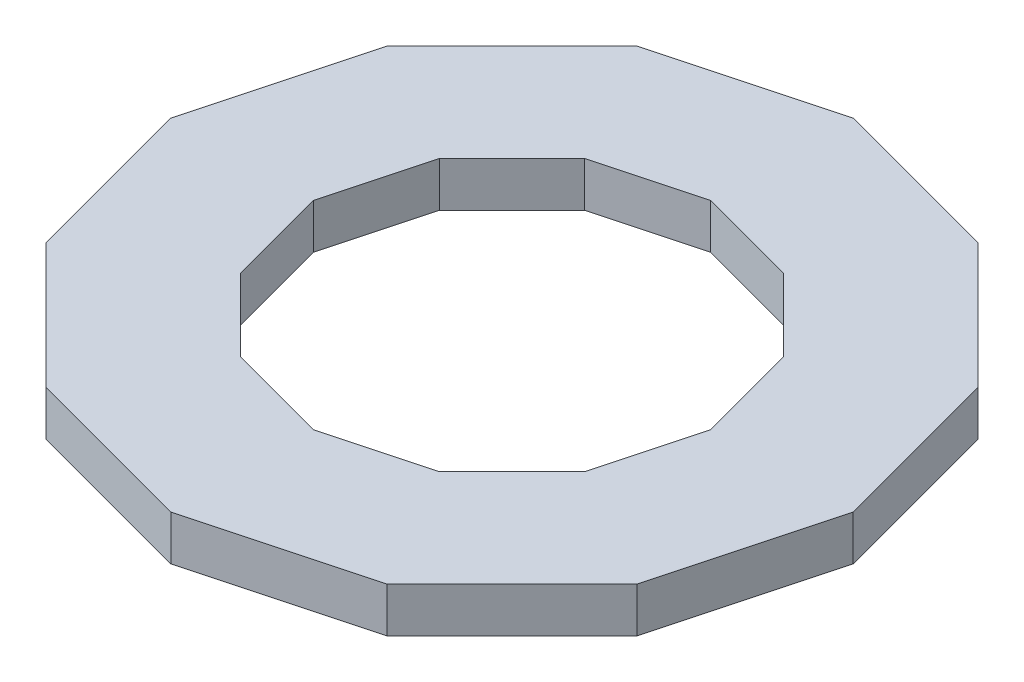
ISO-10303-21;
HEADER;
FILE_DESCRIPTION(('STEP AP214'),'2;1');
FILE_NAME('part.step','',(''),(''),'','','');
FILE_SCHEMA(('AUTOMOTIVE_DESIGN { 1 0 10303 214 1 1 1 1 }'));
ENDSEC;
DATA;
#1=APPLICATION_CONTEXT('core data for automotive mechanical design processes');
#2=APPLICATION_PROTOCOL_DEFINITION('international standard','automotive_design',2000,#1);
#3=PRODUCT_CONTEXT('',#1,'mechanical');
#4=PRODUCT('Part','Part','',(#3));
#5=PRODUCT_RELATED_PRODUCT_CATEGORY('part','',(#4));
#6=PRODUCT_DEFINITION_FORMATION('','',#4);
#7=PRODUCT_DEFINITION_CONTEXT('part definition',#1,'design');
#8=PRODUCT_DEFINITION('design','',#6,#7);
#9=PRODUCT_DEFINITION_SHAPE('','',#8);
#10=(LENGTH_UNIT() NAMED_UNIT(*) SI_UNIT(.MILLI.,.METRE.));
#11=(NAMED_UNIT(*) PLANE_ANGLE_UNIT() SI_UNIT($,.RADIAN.));
#12=(NAMED_UNIT(*) SI_UNIT($,.STERADIAN.) SOLID_ANGLE_UNIT());
#13=UNCERTAINTY_MEASURE_WITH_UNIT(LENGTH_MEASURE(1.E-05),#10,'distance_accuracy_value','');
#14=(GEOMETRIC_REPRESENTATION_CONTEXT(3) GLOBAL_UNCERTAINTY_ASSIGNED_CONTEXT((#13)) GLOBAL_UNIT_ASSIGNED_CONTEXT((#10,
#11,#12)) REPRESENTATION_CONTEXT('',''));
#15=CARTESIAN_POINT('',(0.,0.,0.));
#16=DIRECTION('',(0.,0.,1.));
#17=DIRECTION('',(1.,0.,0.));
#18=AXIS2_PLACEMENT_3D('',#15,#16,#17);
#19=CARTESIAN_POINT('',(0.,19.05,0.));
#20=DIRECTION('',(0.,1.,0.));
#21=DIRECTION('',(0.,0.,1.));
#22=AXIS2_PLACEMENT_3D('',#19,#20,#21);
#23=PLANE('',#22);
#24=DIRECTION('',(-0.258819045102521,0.,0.965925826289068));
#25=VECTOR('',#24,1.);
#26=CARTESIAN_POINT('',(-125.360333278148,19.05,-72.3768221638399));
#27=LINE('',#26,#25);
#28=CARTESIAN_POINT('',(-125.360333278148,19.05,-72.3768221638399));
#29=VERTEX_POINT('',#28);
#30=CARTESIAN_POINT('',(-144.75364432768,19.05,0.));
#31=VERTEX_POINT('',#30);
#32=EDGE_CURVE('E301',#29,#31,#27,.T.);
#33=ORIENTED_EDGE('',*,*,#32,.T.);
#34=DIRECTION('',(0.258819045102521,0.,0.965925826289068));
#35=VECTOR('',#34,1.);
#36=CARTESIAN_POINT('',(-144.75364432768,19.05,0.));
#37=LINE('',#36,#35);
#38=CARTESIAN_POINT('',(-125.360333278148,19.05,72.3768221638398));
#39=VERTEX_POINT('',#38);
#40=EDGE_CURVE('E304',#31,#39,#37,.T.);
#41=ORIENTED_EDGE('',*,*,#40,.T.);
#42=DIRECTION('',(0.707106781186547,0.,0.707106781186548));
#43=VECTOR('',#42,1.);
#44=CARTESIAN_POINT('',(-125.360333278148,19.05,72.3768221638398));
#45=LINE('',#44,#43);
#46=CARTESIAN_POINT('',(-72.3768221638398,19.05,125.360333278148));
#47=VERTEX_POINT('',#46);
#48=EDGE_CURVE('E307',#39,#47,#45,.T.);
#49=ORIENTED_EDGE('',*,*,#48,.T.);
#50=DIRECTION('',(0.965925826289068,0.,0.25881904510252));
#51=VECTOR('',#50,1.);
#52=CARTESIAN_POINT('',(-72.3768221638398,19.05,125.360333278148));
#53=LINE('',#52,#51);
#54=CARTESIAN_POINT('',(0.,19.05,144.75364432768));
#55=VERTEX_POINT('',#54);
#56=EDGE_CURVE('E309',#47,#55,#53,.T.);
#57=ORIENTED_EDGE('',*,*,#56,.T.);
#58=DIRECTION('',(0.965925826289068,0.,-0.258819045102521));
#59=VECTOR('',#58,1.);
#60=CARTESIAN_POINT('',(0.,19.05,144.75364432768));
#61=LINE('',#60,#59);
#62=CARTESIAN_POINT('',(72.3768221638398,19.05,125.360333278148));
#63=VERTEX_POINT('',#62);
#64=EDGE_CURVE('E311',#55,#63,#61,.T.);
#65=ORIENTED_EDGE('',*,*,#64,.T.);
#66=DIRECTION('',(0.707106781186548,0.,-0.707106781186547));
#67=VECTOR('',#66,1.);
#68=CARTESIAN_POINT('',(72.3768221638398,19.05,125.360333278148));
#69=LINE('',#68,#67);
#70=CARTESIAN_POINT('',(125.360333278148,19.05,72.3768221638399));
#71=VERTEX_POINT('',#70);
#72=EDGE_CURVE('E313',#63,#71,#69,.T.);
#73=ORIENTED_EDGE('',*,*,#72,.T.);
#74=DIRECTION('',(0.258819045102521,0.,-0.965925826289068));
#75=VECTOR('',#74,1.);
#76=CARTESIAN_POINT('',(125.360333278148,19.05,72.3768221638399));
#77=LINE('',#76,#75);
#78=CARTESIAN_POINT('',(144.75364432768,19.05,0.));
#79=VERTEX_POINT('',#78);
#80=EDGE_CURVE('E315',#71,#79,#77,.T.);
#81=ORIENTED_EDGE('',*,*,#80,.T.);
#82=DIRECTION('',(-0.258819045102521,0.,-0.965925826289068));
#83=VECTOR('',#82,1.);
#84=CARTESIAN_POINT('',(144.75364432768,19.05,0.));
#85=LINE('',#84,#83);
#86=CARTESIAN_POINT('',(125.360333278148,19.05,-72.3768221638398));
#87=VERTEX_POINT('',#86);
#88=EDGE_CURVE('E317',#79,#87,#85,.T.);
#89=ORIENTED_EDGE('',*,*,#88,.T.);
#90=DIRECTION('',(-0.707106781186547,0.,-0.707106781186548));
#91=VECTOR('',#90,1.);
#92=CARTESIAN_POINT('',(125.360333278148,19.05,-72.3768221638398));
#93=LINE('',#92,#91);
#94=CARTESIAN_POINT('',(72.3768221638398,19.05,-125.360333278148));
#95=VERTEX_POINT('',#94);
#96=EDGE_CURVE('E319',#87,#95,#93,.T.);
#97=ORIENTED_EDGE('',*,*,#96,.T.);
#98=DIRECTION('',(-0.965925826289068,0.,-0.25881904510252));
#99=VECTOR('',#98,1.);
#100=CARTESIAN_POINT('',(72.3768221638398,19.05,-125.360333278148));
#101=LINE('',#100,#99);
#102=CARTESIAN_POINT('',(0.,19.05,-144.75364432768));
#103=VERTEX_POINT('',#102);
#104=EDGE_CURVE('E321',#95,#103,#101,.T.);
#105=ORIENTED_EDGE('',*,*,#104,.T.);
#106=DIRECTION('',(-0.965925826289068,0.,0.258819045102521));
#107=VECTOR('',#106,1.);
#108=CARTESIAN_POINT('',(0.,19.05,-144.75364432768));
#109=LINE('',#108,#107);
#110=CARTESIAN_POINT('',(-72.3768221638398,19.05,-125.360333278148));
#111=VERTEX_POINT('',#110);
#112=EDGE_CURVE('E323',#103,#111,#109,.T.);
#113=ORIENTED_EDGE('',*,*,#112,.T.);
#114=DIRECTION('',(-0.707106781186548,0.,0.707106781186547));
#115=VECTOR('',#114,1.);
#116=CARTESIAN_POINT('',(-72.3768221638398,19.05,-125.360333278148));
#117=LINE('',#116,#115);
#118=EDGE_CURVE('E325',#111,#29,#117,.T.);
#119=ORIENTED_EDGE('',*,*,#118,.T.);
#120=EDGE_LOOP('',(#33,#41,#49,#57,#65,#73,#81,#89,#97,#105,#113,#119));
#121=FACE_BOUND('',#120,.T.);
#122=DIRECTION('',(0.258819045102521,0.,0.965925826289068));
#123=VECTOR('',#122,1.);
#124=CARTESIAN_POINT('',(-84.2728098681227,19.05,0.));
#125=LINE('',#124,#123);
#126=CARTESIAN_POINT('',(-84.2728098681227,19.05,0.));
#127=VERTEX_POINT('',#126);
#128=CARTESIAN_POINT('',(-72.9823941940902,19.05,42.1364049340614));
#129=VERTEX_POINT('',#128);
#130=EDGE_CURVE('E203',#127,#129,#125,.T.);
#131=ORIENTED_EDGE('',*,*,#130,.F.);
#132=DIRECTION('',(-0.25881904510252,0.,0.965925826289068));
#133=VECTOR('',#132,1.);
#134=CARTESIAN_POINT('',(-72.9823941940902,19.05,-42.1364049340613));
#135=LINE('',#134,#133);
#136=CARTESIAN_POINT('',(-72.9823941940902,19.05,-42.1364049340613));
#137=VERTEX_POINT('',#136);
#138=EDGE_CURVE('E195',#137,#127,#135,.T.);
#139=ORIENTED_EDGE('',*,*,#138,.F.);
#140=DIRECTION('',(-0.707106781186547,0.,0.707106781186548));
#141=VECTOR('',#140,1.);
#142=CARTESIAN_POINT('',(-42.1364049340614,19.05,-72.9823941940902));
#143=LINE('',#142,#141);
#144=CARTESIAN_POINT('',(-42.1364049340614,19.05,-72.9823941940902));
#145=VERTEX_POINT('',#144);
#146=EDGE_CURVE('E237',#145,#137,#143,.T.);
#147=ORIENTED_EDGE('',*,*,#146,.F.);
#148=DIRECTION('',(-0.965925826289068,0.,0.258819045102521));
#149=VECTOR('',#148,1.);
#150=CARTESIAN_POINT('',(0.,19.05,-84.2728098681227));
#151=LINE('',#150,#149);
#152=CARTESIAN_POINT('',(0.,19.05,-84.2728098681227));
#153=VERTEX_POINT('',#152);
#154=EDGE_CURVE('E235',#153,#145,#151,.T.);
#155=ORIENTED_EDGE('',*,*,#154,.F.);
#156=DIRECTION('',(-0.965925826289069,0.,-0.25881904510252));
#157=VECTOR('',#156,1.);
#158=CARTESIAN_POINT('',(42.1364049340613,19.05,-72.9823941940902));
#159=LINE('',#158,#157);
#160=CARTESIAN_POINT('',(42.1364049340613,19.05,-72.9823941940902));
#161=VERTEX_POINT('',#160);
#162=EDGE_CURVE('E233',#161,#153,#159,.T.);
#163=ORIENTED_EDGE('',*,*,#162,.F.);
#164=DIRECTION('',(-0.707106781186548,0.,-0.707106781186547));
#165=VECTOR('',#164,1.);
#166=CARTESIAN_POINT('',(72.9823941940902,19.05,-42.1364049340614));
#167=LINE('',#166,#165);
#168=CARTESIAN_POINT('',(72.9823941940902,19.05,-42.1364049340614));
#169=VERTEX_POINT('',#168);
#170=EDGE_CURVE('E231',#169,#161,#167,.T.);
#171=ORIENTED_EDGE('',*,*,#170,.F.);
#172=DIRECTION('',(-0.258819045102521,0.,-0.965925826289068));
#173=VECTOR('',#172,1.);
#174=CARTESIAN_POINT('',(84.2728098681227,19.05,0.));
#175=LINE('',#174,#173);
#176=CARTESIAN_POINT('',(84.2728098681227,19.05,0.));
#177=VERTEX_POINT('',#176);
#178=EDGE_CURVE('E229',#177,#169,#175,.T.);
#179=ORIENTED_EDGE('',*,*,#178,.F.);
#180=DIRECTION('',(0.25881904510252,0.,-0.965925826289069));
#181=VECTOR('',#180,1.);
#182=CARTESIAN_POINT('',(72.9823941940902,19.05,42.1364049340613));
#183=LINE('',#182,#181);
#184=CARTESIAN_POINT('',(72.9823941940902,19.05,42.1364049340613));
#185=VERTEX_POINT('',#184);
#186=EDGE_CURVE('E226',#185,#177,#183,.T.);
#187=ORIENTED_EDGE('',*,*,#186,.F.);
#188=DIRECTION('',(0.707106781186547,0.,-0.707106781186548));
#189=VECTOR('',#188,1.);
#190=CARTESIAN_POINT('',(42.1364049340614,19.05,72.9823941940902));
#191=LINE('',#190,#189);
#192=CARTESIAN_POINT('',(42.1364049340614,19.05,72.9823941940902));
#193=VERTEX_POINT('',#192);
#194=EDGE_CURVE('E224',#193,#185,#191,.T.);
#195=ORIENTED_EDGE('',*,*,#194,.F.);
#196=DIRECTION('',(0.965925826289068,0.,-0.258819045102521));
#197=VECTOR('',#196,1.);
#198=CARTESIAN_POINT('',(0.,19.05,84.2728098681227));
#199=LINE('',#198,#197);
#200=CARTESIAN_POINT('',(0.,19.05,84.2728098681227));
#201=VERTEX_POINT('',#200);
#202=EDGE_CURVE('E222',#201,#193,#199,.T.);
#203=ORIENTED_EDGE('',*,*,#202,.F.);
#204=DIRECTION('',(0.965925826289068,0.,0.258819045102521));
#205=VECTOR('',#204,1.);
#206=CARTESIAN_POINT('',(-42.1364049340614,19.05,72.9823941940902));
#207=LINE('',#206,#205);
#208=CARTESIAN_POINT('',(-42.1364049340614,19.05,72.9823941940902));
#209=VERTEX_POINT('',#208);
#210=EDGE_CURVE('E218',#209,#201,#207,.T.);
#211=ORIENTED_EDGE('',*,*,#210,.F.);
#212=DIRECTION('',(0.707106781186548,0.,0.707106781186547));
#213=VECTOR('',#212,1.);
#214=CARTESIAN_POINT('',(-72.9823941940902,19.05,42.1364049340614));
#215=LINE('',#214,#213);
#216=EDGE_CURVE('E216',#129,#209,#215,.T.);
#217=ORIENTED_EDGE('',*,*,#216,.F.);
#218=EDGE_LOOP('',(#131,#139,#147,#155,#163,#171,#179,#187,#195,#203,#211,#217));
#219=FACE_BOUND('',#218,.T.);
#220=ADVANCED_FACE('F34',(#121,#219),#23,.T.);
#221=CARTESIAN_POINT('',(0.,0.,0.));
#222=DIRECTION('',(0.,1.,0.));
#223=DIRECTION('',(0.,0.,1.));
#224=AXIS2_PLACEMENT_3D('',#221,#222,#223);
#225=PLANE('',#224);
#226=DIRECTION('',(-0.258819045102521,0.,0.965925826289068));
#227=VECTOR('',#226,1.);
#228=CARTESIAN_POINT('',(-125.360333278148,0.,-72.3768221638399));
#229=LINE('',#228,#227);
#230=CARTESIAN_POINT('',(-125.360333278148,0.,-72.3768221638399));
#231=VERTEX_POINT('',#230);
#232=CARTESIAN_POINT('',(-144.75364432768,0.,0.));
#233=VERTEX_POINT('',#232);
#234=EDGE_CURVE('E211',#231,#233,#229,.T.);
#235=ORIENTED_EDGE('',*,*,#234,.F.);
#236=DIRECTION('',(-0.707106781186548,0.,0.707106781186547));
#237=VECTOR('',#236,1.);
#238=CARTESIAN_POINT('',(-72.3768221638398,0.,-125.360333278148));
#239=LINE('',#238,#237);
#240=CARTESIAN_POINT('',(-72.3768221638398,0.,-125.360333278148));
#241=VERTEX_POINT('',#240);
#242=EDGE_CURVE('E305',#241,#231,#239,.T.);
#243=ORIENTED_EDGE('',*,*,#242,.F.);
#244=DIRECTION('',(-0.965925826289068,0.,0.258819045102521));
#245=VECTOR('',#244,1.);
#246=CARTESIAN_POINT('',(0.,0.,-144.75364432768));
#247=LINE('',#246,#245);
#248=CARTESIAN_POINT('',(0.,0.,-144.75364432768));
#249=VERTEX_POINT('',#248);
#250=EDGE_CURVE('E348',#249,#241,#247,.T.);
#251=ORIENTED_EDGE('',*,*,#250,.F.);
#252=DIRECTION('',(-0.965925826289068,0.,-0.25881904510252));
#253=VECTOR('',#252,1.);
#254=CARTESIAN_POINT('',(72.3768221638398,0.,-125.360333278148));
#255=LINE('',#254,#253);
#256=CARTESIAN_POINT('',(72.3768221638398,0.,-125.360333278148));
#257=VERTEX_POINT('',#256);
#258=EDGE_CURVE('E346',#257,#249,#255,.T.);
#259=ORIENTED_EDGE('',*,*,#258,.F.);
#260=DIRECTION('',(-0.707106781186547,0.,-0.707106781186548));
#261=VECTOR('',#260,1.);
#262=CARTESIAN_POINT('',(125.360333278148,0.,-72.3768221638398));
#263=LINE('',#262,#261);
#264=CARTESIAN_POINT('',(125.360333278148,0.,-72.3768221638398));
#265=VERTEX_POINT('',#264);
#266=EDGE_CURVE('E344',#265,#257,#263,.T.);
#267=ORIENTED_EDGE('',*,*,#266,.F.);
#268=DIRECTION('',(-0.258819045102521,0.,-0.965925826289068));
#269=VECTOR('',#268,1.);
#270=CARTESIAN_POINT('',(144.75364432768,0.,0.));
#271=LINE('',#270,#269);
#272=CARTESIAN_POINT('',(144.75364432768,0.,0.));
#273=VERTEX_POINT('',#272);
#274=EDGE_CURVE('E342',#273,#265,#271,.T.);
#275=ORIENTED_EDGE('',*,*,#274,.F.);
#276=DIRECTION('',(0.258819045102521,0.,-0.965925826289068));
#277=VECTOR('',#276,1.);
#278=CARTESIAN_POINT('',(125.360333278148,0.,72.3768221638399));
#279=LINE('',#278,#277);
#280=CARTESIAN_POINT('',(125.360333278148,0.,72.3768221638399));
#281=VERTEX_POINT('',#280);
#282=EDGE_CURVE('E340',#281,#273,#279,.T.);
#283=ORIENTED_EDGE('',*,*,#282,.F.);
#284=DIRECTION('',(0.707106781186548,0.,-0.707106781186547));
#285=VECTOR('',#284,1.);
#286=CARTESIAN_POINT('',(72.3768221638398,0.,125.360333278148));
#287=LINE('',#286,#285);
#288=CARTESIAN_POINT('',(72.3768221638398,0.,125.360333278148));
#289=VERTEX_POINT('',#288);
#290=EDGE_CURVE('E338',#289,#281,#287,.T.);
#291=ORIENTED_EDGE('',*,*,#290,.F.);
#292=DIRECTION('',(0.965925826289068,0.,-0.258819045102521));
#293=VECTOR('',#292,1.);
#294=CARTESIAN_POINT('',(0.,0.,144.75364432768));
#295=LINE('',#294,#293);
#296=CARTESIAN_POINT('',(0.,0.,144.75364432768));
#297=VERTEX_POINT('',#296);
#298=EDGE_CURVE('E336',#297,#289,#295,.T.);
#299=ORIENTED_EDGE('',*,*,#298,.F.);
#300=DIRECTION('',(0.965925826289068,0.,0.25881904510252));
#301=VECTOR('',#300,1.);
#302=CARTESIAN_POINT('',(-72.3768221638398,0.,125.360333278148));
#303=LINE('',#302,#301);
#304=CARTESIAN_POINT('',(-72.3768221638398,0.,125.360333278148));
#305=VERTEX_POINT('',#304);
#306=EDGE_CURVE('E334',#305,#297,#303,.T.);
#307=ORIENTED_EDGE('',*,*,#306,.F.);
#308=DIRECTION('',(0.707106781186547,0.,0.707106781186548));
#309=VECTOR('',#308,1.);
#310=CARTESIAN_POINT('',(-125.360333278148,0.,72.3768221638398));
#311=LINE('',#310,#309);
#312=CARTESIAN_POINT('',(-125.360333278148,0.,72.3768221638398));
#313=VERTEX_POINT('',#312);
#314=EDGE_CURVE('E332',#313,#305,#311,.T.);
#315=ORIENTED_EDGE('',*,*,#314,.F.);
#316=DIRECTION('',(0.258819045102521,0.,0.965925826289068));
#317=VECTOR('',#316,1.);
#318=CARTESIAN_POINT('',(-144.75364432768,0.,0.));
#319=LINE('',#318,#317);
#320=EDGE_CURVE('E330',#233,#313,#319,.T.);
#321=ORIENTED_EDGE('',*,*,#320,.F.);
#322=EDGE_LOOP('',(#235,#243,#251,#259,#267,#275,#283,#291,#299,#307,#315,#321));
#323=FACE_BOUND('',#322,.T.);
#324=DIRECTION('',(-0.25881904510252,0.,0.965925826289068));
#325=VECTOR('',#324,1.);
#326=CARTESIAN_POINT('',(-72.9823941940902,0.,-42.1364049340613));
#327=LINE('',#326,#325);
#328=CARTESIAN_POINT('',(-72.9823941940902,0.,-42.1364049340613));
#329=VERTEX_POINT('',#328);
#330=CARTESIAN_POINT('',(-84.2728098681227,0.,0.));
#331=VERTEX_POINT('',#330);
#332=EDGE_CURVE('E57',#329,#331,#327,.T.);
#333=ORIENTED_EDGE('',*,*,#332,.T.);
#334=DIRECTION('',(0.258819045102521,0.,0.965925826289068));
#335=VECTOR('',#334,1.);
#336=CARTESIAN_POINT('',(-84.2728098681227,0.,0.));
#337=LINE('',#336,#335);
#338=CARTESIAN_POINT('',(-72.9823941940902,0.,42.1364049340614));
#339=VERTEX_POINT('',#338);
#340=EDGE_CURVE('E210',#331,#339,#337,.T.);
#341=ORIENTED_EDGE('',*,*,#340,.T.);
#342=DIRECTION('',(0.707106781186548,0.,0.707106781186547));
#343=VECTOR('',#342,1.);
#344=CARTESIAN_POINT('',(-72.9823941940902,0.,42.1364049340614));
#345=LINE('',#344,#343);
#346=CARTESIAN_POINT('',(-42.1364049340614,0.,72.9823941940902));
#347=VERTEX_POINT('',#346);
#348=EDGE_CURVE('E241',#339,#347,#345,.T.);
#349=ORIENTED_EDGE('',*,*,#348,.T.);
#350=DIRECTION('',(0.965925826289068,0.,0.258819045102521));
#351=VECTOR('',#350,1.);
#352=CARTESIAN_POINT('',(-42.1364049340614,0.,72.9823941940902));
#353=LINE('',#352,#351);
#354=CARTESIAN_POINT('',(0.,0.,84.2728098681227));
#355=VERTEX_POINT('',#354);
#356=EDGE_CURVE('E244',#347,#355,#353,.T.);
#357=ORIENTED_EDGE('',*,*,#356,.T.);
#358=DIRECTION('',(0.965925826289068,0.,-0.258819045102521));
#359=VECTOR('',#358,1.);
#360=CARTESIAN_POINT('',(0.,0.,84.2728098681227));
#361=LINE('',#360,#359);
#362=CARTESIAN_POINT('',(42.1364049340614,0.,72.9823941940902));
#363=VERTEX_POINT('',#362);
#364=EDGE_CURVE('E248',#355,#363,#361,.T.);
#365=ORIENTED_EDGE('',*,*,#364,.T.);
#366=DIRECTION('',(0.707106781186547,0.,-0.707106781186548));
#367=VECTOR('',#366,1.);
#368=CARTESIAN_POINT('',(42.1364049340614,0.,72.9823941940902));
#369=LINE('',#368,#367);
#370=CARTESIAN_POINT('',(72.9823941940902,0.,42.1364049340613));
#371=VERTEX_POINT('',#370);
#372=EDGE_CURVE('E252',#363,#371,#369,.T.);
#373=ORIENTED_EDGE('',*,*,#372,.T.);
#374=DIRECTION('',(0.25881904510252,0.,-0.965925826289069));
#375=VECTOR('',#374,1.);
#376=CARTESIAN_POINT('',(72.9823941940902,0.,42.1364049340613));
#377=LINE('',#376,#375);
#378=CARTESIAN_POINT('',(84.2728098681227,0.,0.));
#379=VERTEX_POINT('',#378);
#380=EDGE_CURVE('E256',#371,#379,#377,.T.);
#381=ORIENTED_EDGE('',*,*,#380,.T.);
#382=DIRECTION('',(-0.258819045102521,0.,-0.965925826289068));
#383=VECTOR('',#382,1.);
#384=CARTESIAN_POINT('',(84.2728098681227,0.,0.));
#385=LINE('',#384,#383);
#386=CARTESIAN_POINT('',(72.9823941940902,0.,-42.1364049340614));
#387=VERTEX_POINT('',#386);
#388=EDGE_CURVE('E259',#379,#387,#385,.T.);
#389=ORIENTED_EDGE('',*,*,#388,.T.);
#390=DIRECTION('',(-0.707106781186548,0.,-0.707106781186547));
#391=VECTOR('',#390,1.);
#392=CARTESIAN_POINT('',(72.9823941940902,0.,-42.1364049340614));
#393=LINE('',#392,#391);
#394=CARTESIAN_POINT('',(42.1364049340613,0.,-72.9823941940902));
#395=VERTEX_POINT('',#394);
#396=EDGE_CURVE('E263',#387,#395,#393,.T.);
#397=ORIENTED_EDGE('',*,*,#396,.T.);
#398=DIRECTION('',(-0.965925826289069,0.,-0.25881904510252));
#399=VECTOR('',#398,1.);
#400=CARTESIAN_POINT('',(42.1364049340613,0.,-72.9823941940902));
#401=LINE('',#400,#399);
#402=CARTESIAN_POINT('',(0.,0.,-84.2728098681227));
#403=VERTEX_POINT('',#402);
#404=EDGE_CURVE('E267',#395,#403,#401,.T.);
#405=ORIENTED_EDGE('',*,*,#404,.T.);
#406=DIRECTION('',(-0.965925826289068,0.,0.258819045102521));
#407=VECTOR('',#406,1.);
#408=CARTESIAN_POINT('',(0.,0.,-84.2728098681227));
#409=LINE('',#408,#407);
#410=CARTESIAN_POINT('',(-42.1364049340614,0.,-72.9823941940902));
#411=VERTEX_POINT('',#410);
#412=EDGE_CURVE('E271',#403,#411,#409,.T.);
#413=ORIENTED_EDGE('',*,*,#412,.T.);
#414=DIRECTION('',(-0.707106781186547,0.,0.707106781186548));
#415=VECTOR('',#414,1.);
#416=CARTESIAN_POINT('',(-42.1364049340614,0.,-72.9823941940902));
#417=LINE('',#416,#415);
#418=EDGE_CURVE('E204',#411,#329,#417,.T.);
#419=ORIENTED_EDGE('',*,*,#418,.T.);
#420=EDGE_LOOP('',(#333,#341,#349,#357,#365,#373,#381,#389,#397,#405,#413,#419));
#421=FACE_BOUND('',#420,.T.);
#422=ADVANCED_FACE('F390',(#323,#421),#225,.F.);
#423=CARTESIAN_POINT('',(-125.360333278148,19.05,-72.3768221638399));
#424=DIRECTION('',(0.965925826289068,0.,0.258819045102521));
#425=DIRECTION('',(0.258819045102521,0.,-0.965925826289068));
#426=AXIS2_PLACEMENT_3D('',#423,#424,#425);
#427=PLANE('',#426);
#428=ORIENTED_EDGE('',*,*,#234,.T.);
#429=DIRECTION('',(0.,-1.,0.));
#430=VECTOR('',#429,1.);
#431=CARTESIAN_POINT('',(-144.75364432768,19.05,0.));
#432=LINE('',#431,#430);
#433=EDGE_CURVE('E11',#31,#233,#432,.T.);
#434=ORIENTED_EDGE('',*,*,#433,.F.);
#435=ORIENTED_EDGE('',*,*,#32,.F.);
#436=DIRECTION('',(0.,-1.,0.));
#437=VECTOR('',#436,1.);
#438=CARTESIAN_POINT('',(-125.360333278148,19.05,-72.3768221638399));
#439=LINE('',#438,#437);
#440=EDGE_CURVE('E327',#29,#231,#439,.T.);
#441=ORIENTED_EDGE('',*,*,#440,.T.);
#442=EDGE_LOOP('',(#428,#434,#435,#441));
#443=FACE_BOUND('',#442,.T.);
#444=ADVANCED_FACE('F36',(#443),#427,.F.);
#445=CARTESIAN_POINT('',(-144.75364432768,19.05,0.));
#446=DIRECTION('',(0.965925826289068,0.,-0.258819045102521));
#447=DIRECTION('',(-0.258819045102521,0.,-0.965925826289068));
#448=AXIS2_PLACEMENT_3D('',#445,#446,#447);
#449=PLANE('',#448);
#450=ORIENTED_EDGE('',*,*,#320,.T.);
#451=DIRECTION('',(0.,-1.,0.));
#452=VECTOR('',#451,1.);
#453=CARTESIAN_POINT('',(-125.360333278148,19.05,72.3768221638398));
#454=LINE('',#453,#452);
#455=EDGE_CURVE('E42',#39,#313,#454,.T.);
#456=ORIENTED_EDGE('',*,*,#455,.F.);
#457=ORIENTED_EDGE('',*,*,#40,.F.);
#458=ORIENTED_EDGE('',*,*,#433,.T.);
#459=EDGE_LOOP('',(#450,#456,#457,#458));
#460=FACE_BOUND('',#459,.T.);
#461=ADVANCED_FACE('F407',(#460),#449,.F.);
#462=CARTESIAN_POINT('',(-125.360333278148,19.05,72.3768221638398));
#463=DIRECTION('',(0.707106781186548,0.,-0.707106781186547));
#464=DIRECTION('',(-0.707106781186547,0.,-0.707106781186548));
#465=AXIS2_PLACEMENT_3D('',#462,#463,#464);
#466=PLANE('',#465);
#467=ORIENTED_EDGE('',*,*,#314,.T.);
#468=DIRECTION('',(0.,-1.,0.));
#469=VECTOR('',#468,1.);
#470=CARTESIAN_POINT('',(-72.3768221638398,19.05,125.360333278148));
#471=LINE('',#470,#469);
#472=EDGE_CURVE('E377',#47,#305,#471,.T.);
#473=ORIENTED_EDGE('',*,*,#472,.F.);
#474=ORIENTED_EDGE('',*,*,#48,.F.);
#475=ORIENTED_EDGE('',*,*,#455,.T.);
#476=EDGE_LOOP('',(#467,#473,#474,#475));
#477=FACE_BOUND('',#476,.T.);
#478=ADVANCED_FACE('F384',(#477),#466,.F.);
#479=CARTESIAN_POINT('',(-72.3768221638398,19.05,125.360333278148));
#480=DIRECTION('',(0.25881904510252,0.,-0.965925826289068));
#481=DIRECTION('',(-0.965925826289069,0.,-0.258819045102521));
#482=AXIS2_PLACEMENT_3D('',#479,#480,#481);
#483=PLANE('',#482);
#484=ORIENTED_EDGE('',*,*,#306,.T.);
#485=DIRECTION('',(0.,-1.,0.));
#486=VECTOR('',#485,1.);
#487=CARTESIAN_POINT('',(0.,19.05,144.75364432768));
#488=LINE('',#487,#486);
#489=EDGE_CURVE('E374',#55,#297,#488,.T.);
#490=ORIENTED_EDGE('',*,*,#489,.F.);
#491=ORIENTED_EDGE('',*,*,#56,.F.);
#492=ORIENTED_EDGE('',*,*,#472,.T.);
#493=EDGE_LOOP('',(#484,#490,#491,#492));
#494=FACE_BOUND('',#493,.T.);
#495=ADVANCED_FACE('F396',(#494),#483,.F.);
#496=CARTESIAN_POINT('',(0.,19.05,144.75364432768));
#497=DIRECTION('',(-0.258819045102521,0.,-0.965925826289068));
#498=DIRECTION('',(-0.965925826289068,0.,0.258819045102521));
#499=AXIS2_PLACEMENT_3D('',#496,#497,#498);
#500=PLANE('',#499);
#501=ORIENTED_EDGE('',*,*,#298,.T.);
#502=DIRECTION('',(0.,-1.,0.));
#503=VECTOR('',#502,1.);
#504=CARTESIAN_POINT('',(72.3768221638398,19.05,125.360333278148));
#505=LINE('',#504,#503);
#506=EDGE_CURVE('E371',#63,#289,#505,.T.);
#507=ORIENTED_EDGE('',*,*,#506,.F.);
#508=ORIENTED_EDGE('',*,*,#64,.F.);
#509=ORIENTED_EDGE('',*,*,#489,.T.);
#510=EDGE_LOOP('',(#501,#507,#508,#509));
#511=FACE_BOUND('',#510,.T.);
#512=ADVANCED_FACE('F400',(#511),#500,.F.);
#513=CARTESIAN_POINT('',(72.3768221638398,19.05,125.360333278148));
#514=DIRECTION('',(-0.707106781186547,0.,-0.707106781186548));
#515=DIRECTION('',(-0.707106781186548,0.,0.707106781186547));
#516=AXIS2_PLACEMENT_3D('',#513,#514,#515);
#517=PLANE('',#516);
#518=ORIENTED_EDGE('',*,*,#290,.T.);
#519=DIRECTION('',(0.,-1.,0.));
#520=VECTOR('',#519,1.);
#521=CARTESIAN_POINT('',(125.360333278148,19.05,72.3768221638399));
#522=LINE('',#521,#520);
#523=EDGE_CURVE('E368',#71,#281,#522,.T.);
#524=ORIENTED_EDGE('',*,*,#523,.F.);
#525=ORIENTED_EDGE('',*,*,#72,.F.);
#526=ORIENTED_EDGE('',*,*,#506,.T.);
#527=EDGE_LOOP('',(#518,#524,#525,#526));
#528=FACE_BOUND('',#527,.T.);
#529=ADVANCED_FACE('F440',(#528),#517,.F.);
#530=CARTESIAN_POINT('',(125.360333278148,19.05,72.3768221638399));
#531=DIRECTION('',(-0.965925826289068,0.,-0.258819045102521));
#532=DIRECTION('',(-0.258819045102521,0.,0.965925826289068));
#533=AXIS2_PLACEMENT_3D('',#530,#531,#532);
#534=PLANE('',#533);
#535=ORIENTED_EDGE('',*,*,#282,.T.);
#536=DIRECTION('',(0.,-1.,0.));
#537=VECTOR('',#536,1.);
#538=CARTESIAN_POINT('',(144.75364432768,19.05,0.));
#539=LINE('',#538,#537);
#540=EDGE_CURVE('E365',#79,#273,#539,.T.);
#541=ORIENTED_EDGE('',*,*,#540,.F.);
#542=ORIENTED_EDGE('',*,*,#80,.F.);
#543=ORIENTED_EDGE('',*,*,#523,.T.);
#544=EDGE_LOOP('',(#535,#541,#542,#543));
#545=FACE_BOUND('',#544,.T.);
#546=ADVANCED_FACE('F438',(#545),#534,.F.);
#547=CARTESIAN_POINT('',(144.75364432768,19.05,0.));
#548=DIRECTION('',(-0.965925826289068,0.,0.258819045102521));
#549=DIRECTION('',(0.258819045102521,0.,0.965925826289068));
#550=AXIS2_PLACEMENT_3D('',#547,#548,#549);
#551=PLANE('',#550);
#552=ORIENTED_EDGE('',*,*,#274,.T.);
#553=DIRECTION('',(0.,-1.,0.));
#554=VECTOR('',#553,1.);
#555=CARTESIAN_POINT('',(125.360333278148,19.05,-72.3768221638398));
#556=LINE('',#555,#554);
#557=EDGE_CURVE('E362',#87,#265,#556,.T.);
#558=ORIENTED_EDGE('',*,*,#557,.F.);
#559=ORIENTED_EDGE('',*,*,#88,.F.);
#560=ORIENTED_EDGE('',*,*,#540,.T.);
#561=EDGE_LOOP('',(#552,#558,#559,#560));
#562=FACE_BOUND('',#561,.T.);
#563=ADVANCED_FACE('F434',(#562),#551,.F.);
#564=CARTESIAN_POINT('',(125.360333278148,19.05,-72.3768221638398));
#565=DIRECTION('',(-0.707106781186548,0.,0.707106781186547));
#566=DIRECTION('',(0.707106781186547,0.,0.707106781186548));
#567=AXIS2_PLACEMENT_3D('',#564,#565,#566);
#568=PLANE('',#567);
#569=ORIENTED_EDGE('',*,*,#266,.T.);
#570=DIRECTION('',(0.,-1.,0.));
#571=VECTOR('',#570,1.);
#572=CARTESIAN_POINT('',(72.3768221638398,19.05,-125.360333278148));
#573=LINE('',#572,#571);
#574=EDGE_CURVE('E359',#95,#257,#573,.T.);
#575=ORIENTED_EDGE('',*,*,#574,.F.);
#576=ORIENTED_EDGE('',*,*,#96,.F.);
#577=ORIENTED_EDGE('',*,*,#557,.T.);
#578=EDGE_LOOP('',(#569,#575,#576,#577));
#579=FACE_BOUND('',#578,.T.);
#580=ADVANCED_FACE('F429',(#579),#568,.F.);
#581=CARTESIAN_POINT('',(72.3768221638398,19.05,-125.360333278148));
#582=DIRECTION('',(-0.25881904510252,0.,0.965925826289068));
#583=DIRECTION('',(0.965925826289069,0.,0.25881904510252));
#584=AXIS2_PLACEMENT_3D('',#581,#582,#583);
#585=PLANE('',#584);
#586=ORIENTED_EDGE('',*,*,#258,.T.);
#587=DIRECTION('',(0.,-1.,0.));
#588=VECTOR('',#587,1.);
#589=CARTESIAN_POINT('',(0.,19.05,-144.75364432768));
#590=LINE('',#589,#588);
#591=EDGE_CURVE('E356',#103,#249,#590,.T.);
#592=ORIENTED_EDGE('',*,*,#591,.F.);
#593=ORIENTED_EDGE('',*,*,#104,.F.);
#594=ORIENTED_EDGE('',*,*,#574,.T.);
#595=EDGE_LOOP('',(#586,#592,#593,#594));
#596=FACE_BOUND('',#595,.T.);
#597=ADVANCED_FACE('F423',(#596),#585,.F.);
#598=CARTESIAN_POINT('',(0.,19.05,-144.75364432768));
#599=DIRECTION('',(0.258819045102521,0.,0.965925826289068));
#600=DIRECTION('',(0.965925826289068,0.,-0.258819045102521));
#601=AXIS2_PLACEMENT_3D('',#598,#599,#600);
#602=PLANE('',#601);
#603=ORIENTED_EDGE('',*,*,#250,.T.);
#604=DIRECTION('',(0.,-1.,0.));
#605=VECTOR('',#604,1.);
#606=CARTESIAN_POINT('',(-72.3768221638398,19.05,-125.360333278148));
#607=LINE('',#606,#605);
#608=EDGE_CURVE('E353',#111,#241,#607,.T.);
#609=ORIENTED_EDGE('',*,*,#608,.F.);
#610=ORIENTED_EDGE('',*,*,#112,.F.);
#611=ORIENTED_EDGE('',*,*,#591,.T.);
#612=EDGE_LOOP('',(#603,#609,#610,#611));
#613=FACE_BOUND('',#612,.T.);
#614=ADVANCED_FACE('F419',(#613),#602,.F.);
#615=CARTESIAN_POINT('',(-72.3768221638398,19.05,-125.360333278148));
#616=DIRECTION('',(0.707106781186547,0.,0.707106781186548));
#617=DIRECTION('',(0.707106781186548,0.,-0.707106781186547));
#618=AXIS2_PLACEMENT_3D('',#615,#616,#617);
#619=PLANE('',#618);
#620=ORIENTED_EDGE('',*,*,#242,.T.);
#621=ORIENTED_EDGE('',*,*,#440,.F.);
#622=ORIENTED_EDGE('',*,*,#118,.F.);
#623=ORIENTED_EDGE('',*,*,#608,.T.);
#624=EDGE_LOOP('',(#620,#621,#622,#623));
#625=FACE_BOUND('',#624,.T.);
#626=ADVANCED_FACE('F414',(#625),#619,.F.);
#627=CARTESIAN_POINT('',(-72.9823941940902,19.05,-42.1364049340613));
#628=DIRECTION('',(0.965925826289068,0.,0.25881904510252));
#629=DIRECTION('',(0.25881904510252,0.,-0.965925826289069));
#630=AXIS2_PLACEMENT_3D('',#627,#628,#629);
#631=PLANE('',#630);
#632=ORIENTED_EDGE('',*,*,#332,.F.);
#633=DIRECTION('',(0.,-1.,0.));
#634=VECTOR('',#633,1.);
#635=CARTESIAN_POINT('',(-72.9823941940902,19.05,-42.1364049340613));
#636=LINE('',#635,#634);
#637=EDGE_CURVE('E199',#137,#329,#636,.T.);
#638=ORIENTED_EDGE('',*,*,#637,.F.);
#639=ORIENTED_EDGE('',*,*,#138,.T.);
#640=DIRECTION('',(0.,-1.,0.));
#641=VECTOR('',#640,1.);
#642=CARTESIAN_POINT('',(-84.2728098681227,19.05,0.));
#643=LINE('',#642,#641);
#644=EDGE_CURVE('E198',#127,#331,#643,.T.);
#645=ORIENTED_EDGE('',*,*,#644,.T.);
#646=EDGE_LOOP('',(#632,#638,#639,#645));
#647=FACE_BOUND('',#646,.T.);
#648=ADVANCED_FACE('F197',(#647),#631,.T.);
#649=CARTESIAN_POINT('',(-84.2728098681227,19.05,0.));
#650=DIRECTION('',(0.965925826289068,0.,-0.258819045102521));
#651=DIRECTION('',(-0.258819045102521,0.,-0.965925826289068));
#652=AXIS2_PLACEMENT_3D('',#649,#650,#651);
#653=PLANE('',#652);
#654=ORIENTED_EDGE('',*,*,#340,.F.);
#655=ORIENTED_EDGE('',*,*,#644,.F.);
#656=ORIENTED_EDGE('',*,*,#130,.T.);
#657=DIRECTION('',(0.,-1.,0.));
#658=VECTOR('',#657,1.);
#659=CARTESIAN_POINT('',(-72.9823941940902,19.05,42.1364049340614));
#660=LINE('',#659,#658);
#661=EDGE_CURVE('E212',#129,#339,#660,.T.);
#662=ORIENTED_EDGE('',*,*,#661,.T.);
#663=EDGE_LOOP('',(#654,#655,#656,#662));
#664=FACE_BOUND('',#663,.T.);
#665=ADVANCED_FACE('F207',(#664),#653,.T.);
#666=CARTESIAN_POINT('',(-72.9823941940902,19.05,42.1364049340614));
#667=DIRECTION('',(0.707106781186547,0.,-0.707106781186548));
#668=DIRECTION('',(-0.707106781186548,0.,-0.707106781186547));
#669=AXIS2_PLACEMENT_3D('',#666,#667,#668);
#670=PLANE('',#669);
#671=ORIENTED_EDGE('',*,*,#348,.F.);
#672=ORIENTED_EDGE('',*,*,#661,.F.);
#673=ORIENTED_EDGE('',*,*,#216,.T.);
#674=DIRECTION('',(0.,-1.,0.));
#675=VECTOR('',#674,1.);
#676=CARTESIAN_POINT('',(-42.1364049340614,19.05,72.9823941940902));
#677=LINE('',#676,#675);
#678=EDGE_CURVE('E297',#209,#347,#677,.T.);
#679=ORIENTED_EDGE('',*,*,#678,.T.);
#680=EDGE_LOOP('',(#671,#672,#673,#679));
#681=FACE_BOUND('',#680,.T.);
#682=ADVANCED_FACE('F498',(#681),#670,.T.);
#683=CARTESIAN_POINT('',(-42.1364049340614,19.05,72.9823941940902));
#684=DIRECTION('',(0.258819045102521,0.,-0.965925826289068));
#685=DIRECTION('',(-0.965925826289068,0.,-0.258819045102521));
#686=AXIS2_PLACEMENT_3D('',#683,#684,#685);
#687=PLANE('',#686);
#688=ORIENTED_EDGE('',*,*,#356,.F.);
#689=ORIENTED_EDGE('',*,*,#678,.F.);
#690=ORIENTED_EDGE('',*,*,#210,.T.);
#691=DIRECTION('',(0.,-1.,0.));
#692=VECTOR('',#691,1.);
#693=CARTESIAN_POINT('',(0.,19.05,84.2728098681227));
#694=LINE('',#693,#692);
#695=EDGE_CURVE('E294',#201,#355,#694,.T.);
#696=ORIENTED_EDGE('',*,*,#695,.T.);
#697=EDGE_LOOP('',(#688,#689,#690,#696));
#698=FACE_BOUND('',#697,.T.);
#699=ADVANCED_FACE('F504',(#698),#687,.T.);
#700=CARTESIAN_POINT('',(0.,19.05,84.2728098681227));
#701=DIRECTION('',(-0.258819045102521,0.,-0.965925826289068));
#702=DIRECTION('',(-0.965925826289068,0.,0.258819045102521));
#703=AXIS2_PLACEMENT_3D('',#700,#701,#702);
#704=PLANE('',#703);
#705=ORIENTED_EDGE('',*,*,#364,.F.);
#706=ORIENTED_EDGE('',*,*,#695,.F.);
#707=ORIENTED_EDGE('',*,*,#202,.T.);
#708=DIRECTION('',(0.,-1.,0.));
#709=VECTOR('',#708,1.);
#710=CARTESIAN_POINT('',(42.1364049340614,19.05,72.9823941940902));
#711=LINE('',#710,#709);
#712=EDGE_CURVE('E292',#193,#363,#711,.T.);
#713=ORIENTED_EDGE('',*,*,#712,.T.);
#714=EDGE_LOOP('',(#705,#706,#707,#713));
#715=FACE_BOUND('',#714,.T.);
#716=ADVANCED_FACE('F512',(#715),#704,.T.);
#717=CARTESIAN_POINT('',(42.1364049340614,19.05,72.9823941940902));
#718=DIRECTION('',(-0.707106781186548,0.,-0.707106781186547));
#719=DIRECTION('',(-0.707106781186547,0.,0.707106781186548));
#720=AXIS2_PLACEMENT_3D('',#717,#718,#719);
#721=PLANE('',#720);
#722=ORIENTED_EDGE('',*,*,#372,.F.);
#723=ORIENTED_EDGE('',*,*,#712,.F.);
#724=ORIENTED_EDGE('',*,*,#194,.T.);
#725=DIRECTION('',(0.,-1.,0.));
#726=VECTOR('',#725,1.);
#727=CARTESIAN_POINT('',(72.9823941940902,19.05,42.1364049340613));
#728=LINE('',#727,#726);
#729=EDGE_CURVE('E289',#185,#371,#728,.T.);
#730=ORIENTED_EDGE('',*,*,#729,.T.);
#731=EDGE_LOOP('',(#722,#723,#724,#730));
#732=FACE_BOUND('',#731,.T.);
#733=ADVANCED_FACE('F520',(#732),#721,.T.);
#734=CARTESIAN_POINT('',(72.9823941940902,19.05,42.1364049340613));
#735=DIRECTION('',(-0.965925826289068,0.,-0.25881904510252));
#736=DIRECTION('',(-0.25881904510252,0.,0.965925826289069));
#737=AXIS2_PLACEMENT_3D('',#734,#735,#736);
#738=PLANE('',#737);
#739=ORIENTED_EDGE('',*,*,#380,.F.);
#740=ORIENTED_EDGE('',*,*,#729,.F.);
#741=ORIENTED_EDGE('',*,*,#186,.T.);
#742=DIRECTION('',(0.,-1.,0.));
#743=VECTOR('',#742,1.);
#744=CARTESIAN_POINT('',(84.2728098681227,19.05,0.));
#745=LINE('',#744,#743);
#746=EDGE_CURVE('E287',#177,#379,#745,.T.);
#747=ORIENTED_EDGE('',*,*,#746,.T.);
#748=EDGE_LOOP('',(#739,#740,#741,#747));
#749=FACE_BOUND('',#748,.T.);
#750=ADVANCED_FACE('F528',(#749),#738,.T.);
#751=CARTESIAN_POINT('',(84.2728098681227,19.05,0.));
#752=DIRECTION('',(-0.965925826289068,0.,0.258819045102521));
#753=DIRECTION('',(0.258819045102521,0.,0.965925826289068));
#754=AXIS2_PLACEMENT_3D('',#751,#752,#753);
#755=PLANE('',#754);
#756=ORIENTED_EDGE('',*,*,#388,.F.);
#757=ORIENTED_EDGE('',*,*,#746,.F.);
#758=ORIENTED_EDGE('',*,*,#178,.T.);
#759=DIRECTION('',(0.,-1.,0.));
#760=VECTOR('',#759,1.);
#761=CARTESIAN_POINT('',(72.9823941940902,19.05,-42.1364049340614));
#762=LINE('',#761,#760);
#763=EDGE_CURVE('E284',#169,#387,#762,.T.);
#764=ORIENTED_EDGE('',*,*,#763,.T.);
#765=EDGE_LOOP('',(#756,#757,#758,#764));
#766=FACE_BOUND('',#765,.T.);
#767=ADVANCED_FACE('F536',(#766),#755,.T.);
#768=CARTESIAN_POINT('',(72.9823941940902,19.05,-42.1364049340614));
#769=DIRECTION('',(-0.707106781186547,0.,0.707106781186548));
#770=DIRECTION('',(0.707106781186548,0.,0.707106781186547));
#771=AXIS2_PLACEMENT_3D('',#768,#769,#770);
#772=PLANE('',#771);
#773=ORIENTED_EDGE('',*,*,#396,.F.);
#774=ORIENTED_EDGE('',*,*,#763,.F.);
#775=ORIENTED_EDGE('',*,*,#170,.T.);
#776=DIRECTION('',(0.,-1.,0.));
#777=VECTOR('',#776,1.);
#778=CARTESIAN_POINT('',(42.1364049340613,19.05,-72.9823941940902));
#779=LINE('',#778,#777);
#780=EDGE_CURVE('E281',#161,#395,#779,.T.);
#781=ORIENTED_EDGE('',*,*,#780,.T.);
#782=EDGE_LOOP('',(#773,#774,#775,#781));
#783=FACE_BOUND('',#782,.T.);
#784=ADVANCED_FACE('F544',(#783),#772,.T.);
#785=CARTESIAN_POINT('',(42.1364049340613,19.05,-72.9823941940902));
#786=DIRECTION('',(-0.25881904510252,0.,0.965925826289068));
#787=DIRECTION('',(0.965925826289068,0.,0.25881904510252));
#788=AXIS2_PLACEMENT_3D('',#785,#786,#787);
#789=PLANE('',#788);
#790=ORIENTED_EDGE('',*,*,#404,.F.);
#791=ORIENTED_EDGE('',*,*,#780,.F.);
#792=ORIENTED_EDGE('',*,*,#162,.T.);
#793=DIRECTION('',(0.,-1.,0.));
#794=VECTOR('',#793,1.);
#795=CARTESIAN_POINT('',(0.,19.05,-84.2728098681227));
#796=LINE('',#795,#794);
#797=EDGE_CURVE('E279',#153,#403,#796,.T.);
#798=ORIENTED_EDGE('',*,*,#797,.T.);
#799=EDGE_LOOP('',(#790,#791,#792,#798));
#800=FACE_BOUND('',#799,.T.);
#801=ADVANCED_FACE('F552',(#800),#789,.T.);
#802=CARTESIAN_POINT('',(0.,19.05,-84.2728098681227));
#803=DIRECTION('',(0.258819045102521,0.,0.965925826289068));
#804=DIRECTION('',(0.965925826289068,0.,-0.258819045102521));
#805=AXIS2_PLACEMENT_3D('',#802,#803,#804);
#806=PLANE('',#805);
#807=ORIENTED_EDGE('',*,*,#412,.F.);
#808=ORIENTED_EDGE('',*,*,#797,.F.);
#809=ORIENTED_EDGE('',*,*,#154,.T.);
#810=DIRECTION('',(0.,-1.,0.));
#811=VECTOR('',#810,1.);
#812=CARTESIAN_POINT('',(-42.1364049340614,19.05,-72.9823941940902));
#813=LINE('',#812,#811);
#814=EDGE_CURVE('E49',#145,#411,#813,.T.);
#815=ORIENTED_EDGE('',*,*,#814,.T.);
#816=EDGE_LOOP('',(#807,#808,#809,#815));
#817=FACE_BOUND('',#816,.T.);
#818=ADVANCED_FACE('F560',(#817),#806,.T.);
#819=CARTESIAN_POINT('',(-42.1364049340614,19.05,-72.9823941940902));
#820=DIRECTION('',(0.707106781186548,0.,0.707106781186547));
#821=DIRECTION('',(0.707106781186547,0.,-0.707106781186548));
#822=AXIS2_PLACEMENT_3D('',#819,#820,#821);
#823=PLANE('',#822);
#824=ORIENTED_EDGE('',*,*,#418,.F.);
#825=ORIENTED_EDGE('',*,*,#814,.F.);
#826=ORIENTED_EDGE('',*,*,#146,.T.);
#827=ORIENTED_EDGE('',*,*,#637,.T.);
#828=EDGE_LOOP('',(#824,#825,#826,#827));
#829=FACE_BOUND('',#828,.T.);
#830=ADVANCED_FACE('F568',(#829),#823,.T.);
#831=CLOSED_SHELL('',(#220,#422,#444,#461,#478,#495,#512,#529,#546,#563,#580,#597,#614,#626,
#648,#665,#682,#699,#716,#733,#750,#767,#784,#801,#818,#830));
#832=MANIFOLD_SOLID_BREP('B2',#831);
#833=ADVANCED_BREP_SHAPE_REPRESENTATION('',(#18,#832),#14);
#834=SHAPE_DEFINITION_REPRESENTATION(#9,#833);
ENDSEC;
END-ISO-10303-21;
